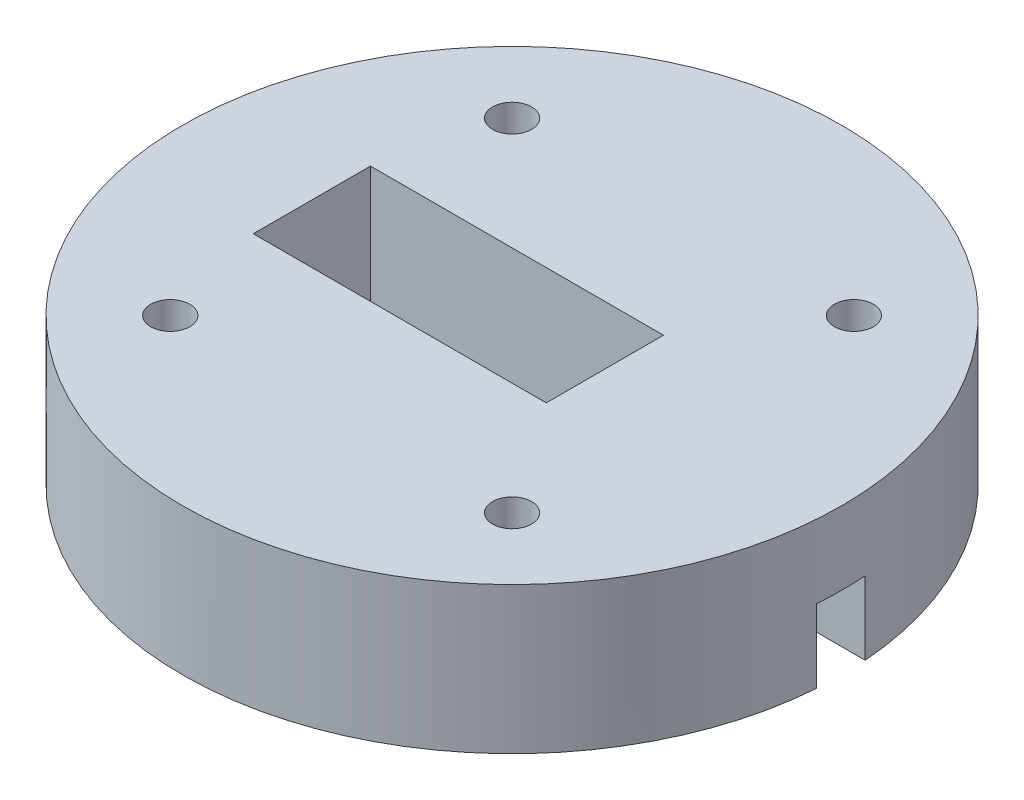
ISO-10303-21;
HEADER;
FILE_DESCRIPTION(('STEP AP214'),'2;1');
FILE_NAME('part.step','',(''),(''),'','','');
FILE_SCHEMA(('AUTOMOTIVE_DESIGN { 1 0 10303 214 1 1 1 1 }'));
ENDSEC;
DATA;
#1=APPLICATION_CONTEXT('core data for automotive mechanical design processes');
#2=APPLICATION_PROTOCOL_DEFINITION('international standard','automotive_design',2000,#1);
#3=PRODUCT_CONTEXT('',#1,'mechanical');
#4=PRODUCT('Part','Part','',(#3));
#5=PRODUCT_RELATED_PRODUCT_CATEGORY('part','',(#4));
#6=PRODUCT_DEFINITION_FORMATION('','',#4);
#7=PRODUCT_DEFINITION_CONTEXT('part definition',#1,'design');
#8=PRODUCT_DEFINITION('design','',#6,#7);
#9=PRODUCT_DEFINITION_SHAPE('','',#8);
#10=(LENGTH_UNIT() NAMED_UNIT(*) SI_UNIT(.MILLI.,.METRE.));
#11=(NAMED_UNIT(*) PLANE_ANGLE_UNIT() SI_UNIT($,.RADIAN.));
#12=(NAMED_UNIT(*) SI_UNIT($,.STERADIAN.) SOLID_ANGLE_UNIT());
#13=UNCERTAINTY_MEASURE_WITH_UNIT(LENGTH_MEASURE(1.E-05),#10,'distance_accuracy_value','');
#14=(GEOMETRIC_REPRESENTATION_CONTEXT(3) GLOBAL_UNCERTAINTY_ASSIGNED_CONTEXT((#13)) GLOBAL_UNIT_ASSIGNED_CONTEXT((#10,
#11,#12)) REPRESENTATION_CONTEXT('',''));
#15=CARTESIAN_POINT('',(0.,0.,0.));
#16=DIRECTION('',(0.,0.,1.));
#17=DIRECTION('',(1.,0.,0.));
#18=AXIS2_PLACEMENT_3D('',#15,#16,#17);
#19=CARTESIAN_POINT('',(0.,30.,0.));
#20=DIRECTION('',(0.,-1.,0.));
#21=DIRECTION('',(0.,0.,-1.));
#22=AXIS2_PLACEMENT_3D('',#19,#20,#21);
#23=CYLINDRICAL_SURFACE('',#22,67.5);
#24=CARTESIAN_POINT('',(0.,30.,0.));
#25=DIRECTION('',(0.,1.,0.));
#26=DIRECTION('',(0.,0.,1.));
#27=AXIS2_PLACEMENT_3D('',#24,#25,#26);
#28=CIRCLE('',#27,67.5);
#29=CARTESIAN_POINT('',(0.,30.,67.5));
#30=VERTEX_POINT('',#29);
#31=EDGE_CURVE('E117',#30,#30,#28,.T.);
#32=ORIENTED_EDGE('',*,*,#31,.F.);
#33=EDGE_LOOP('',(#32));
#34=FACE_BOUND('',#33,.T.);
#35=DIRECTION('',(0.,-1.,0.));
#36=VECTOR('',#35,1.);
#37=CARTESIAN_POINT('',(67.3145600891813,30.,-5.));
#38=LINE('',#37,#36);
#39=CARTESIAN_POINT('',(67.3145600891813,0.,-5.));
#40=VERTEX_POINT('',#39);
#41=CARTESIAN_POINT('',(67.3145600891813,15.,-5.));
#42=VERTEX_POINT('',#41);
#43=EDGE_CURVE('E100',#40,#42,#38,.F.);
#44=ORIENTED_EDGE('',*,*,#43,.F.);
#45=CARTESIAN_POINT('',(0.,0.,0.));
#46=DIRECTION('',(0.,1.,0.));
#47=DIRECTION('',(0.,0.,1.));
#48=AXIS2_PLACEMENT_3D('',#45,#46,#47);
#49=CIRCLE('',#48,67.5);
#50=CARTESIAN_POINT('',(67.3145600891813,0.,5.));
#51=VERTEX_POINT('',#50);
#52=EDGE_CURVE('E112',#40,#51,#49,.T.);
#53=ORIENTED_EDGE('',*,*,#52,.T.);
#54=DIRECTION('',(0.,-1.,0.));
#55=VECTOR('',#54,1.);
#56=CARTESIAN_POINT('',(67.3145600891813,30.,5.));
#57=LINE('',#56,#55);
#58=CARTESIAN_POINT('',(67.3145600891813,15.,5.));
#59=VERTEX_POINT('',#58);
#60=EDGE_CURVE('E134',#59,#51,#57,.T.);
#61=ORIENTED_EDGE('',*,*,#60,.F.);
#62=CARTESIAN_POINT('',(0.,15.,0.));
#63=DIRECTION('',(0.,-1.,0.));
#64=DIRECTION('',(0.,0.,-1.));
#65=AXIS2_PLACEMENT_3D('',#62,#63,#64);
#66=CIRCLE('',#65,67.5);
#67=EDGE_CURVE('E113',#42,#59,#66,.T.);
#68=ORIENTED_EDGE('',*,*,#67,.F.);
#69=EDGE_LOOP('',(#44,#53,#61,#68));
#70=FACE_BOUND('',#69,.T.);
#71=ADVANCED_FACE('F33',(#34,#70),#23,.T.);
#72=CARTESIAN_POINT('',(0.,0.,0.));
#73=DIRECTION('',(0.,1.,0.));
#74=DIRECTION('',(0.,0.,1.));
#75=AXIS2_PLACEMENT_3D('',#72,#73,#74);
#76=PLANE('',#75);
#77=CARTESIAN_POINT('',(-35.0017856687342,0.,-35.0017856687321));
#78=DIRECTION('',(0.,1.,0.));
#79=DIRECTION('',(0.,0.,1.));
#80=AXIS2_PLACEMENT_3D('',#77,#78,#79);
#81=CIRCLE('',#80,4.00000000000209);
#82=CARTESIAN_POINT('',(-35.0017856687342,0.,-31.00178566873));
#83=VERTEX_POINT('',#82);
#84=EDGE_CURVE('E194',#83,#83,#81,.T.);
#85=ORIENTED_EDGE('',*,*,#84,.T.);
#86=EDGE_LOOP('',(#85));
#87=FACE_BOUND('',#86,.T.);
#88=CARTESIAN_POINT('',(-35.0017856687321,0.,35.0017856687361));
#89=DIRECTION('',(0.,1.,0.));
#90=DIRECTION('',(0.,0.,1.));
#91=AXIS2_PLACEMENT_3D('',#88,#89,#90);
#92=CIRCLE('',#91,4.00000000000143);
#93=CARTESIAN_POINT('',(-35.0017856687321,0.,39.0017856687375));
#94=VERTEX_POINT('',#93);
#95=EDGE_CURVE('E200',#94,#94,#92,.T.);
#96=ORIENTED_EDGE('',*,*,#95,.T.);
#97=EDGE_LOOP('',(#96));
#98=FACE_BOUND('',#97,.T.);
#99=CARTESIAN_POINT('',(35.0017856687361,0.,35.0017856687341));
#100=DIRECTION('',(0.,1.,0.));
#101=DIRECTION('',(0.,0.,1.));
#102=AXIS2_PLACEMENT_3D('',#99,#100,#101);
#103=CIRCLE('',#102,3.99999999999952);
#104=CARTESIAN_POINT('',(35.0017856687361,0.,39.0017856687336));
#105=VERTEX_POINT('',#104);
#106=EDGE_CURVE('E188',#105,#105,#103,.T.);
#107=ORIENTED_EDGE('',*,*,#106,.T.);
#108=EDGE_LOOP('',(#107));
#109=FACE_BOUND('',#108,.T.);
#110=CARTESIAN_POINT('',(35.0017856687341,0.,-35.0017856687342));
#111=DIRECTION('',(0.,1.,0.));
#112=DIRECTION('',(0.,0.,1.));
#113=AXIS2_PLACEMENT_3D('',#110,#111,#112);
#114=CIRCLE('',#113,4.);
#115=CARTESIAN_POINT('',(35.0017856687341,0.,-31.0017856687342));
#116=VERTEX_POINT('',#115);
#117=EDGE_CURVE('E106',#116,#116,#114,.T.);
#118=ORIENTED_EDGE('',*,*,#117,.T.);
#119=EDGE_LOOP('',(#118));
#120=FACE_BOUND('',#119,.T.);
#121=DIRECTION('',(-1.,0.,0.));
#122=VECTOR('',#121,1.);
#123=CARTESIAN_POINT('',(97.,0.,-5.));
#124=LINE('',#123,#122);
#125=CARTESIAN_POINT('',(19.,0.,-5.));
#126=VERTEX_POINT('',#125);
#127=EDGE_CURVE('E96',#40,#126,#124,.T.);
#128=ORIENTED_EDGE('',*,*,#127,.T.);
#129=DIRECTION('',(0.,0.,-1.));
#130=VECTOR('',#129,1.);
#131=CARTESIAN_POINT('',(19.,0.,12.));
#132=LINE('',#131,#130);
#133=CARTESIAN_POINT('',(19.,0.,-12.));
#134=VERTEX_POINT('',#133);
#135=EDGE_CURVE('E137',#126,#134,#132,.T.);
#136=ORIENTED_EDGE('',*,*,#135,.T.);
#137=DIRECTION('',(-1.,0.,0.));
#138=VECTOR('',#137,1.);
#139=CARTESIAN_POINT('',(-41.,0.,-12.));
#140=LINE('',#139,#138);
#141=CARTESIAN_POINT('',(-41.,0.,-12.));
#142=VERTEX_POINT('',#141);
#143=EDGE_CURVE('E144',#134,#142,#140,.T.);
#144=ORIENTED_EDGE('',*,*,#143,.T.);
#145=DIRECTION('',(0.,0.,1.));
#146=VECTOR('',#145,1.);
#147=CARTESIAN_POINT('',(-41.,0.,12.));
#148=LINE('',#147,#146);
#149=CARTESIAN_POINT('',(-41.,0.,12.));
#150=VERTEX_POINT('',#149);
#151=EDGE_CURVE('E151',#142,#150,#148,.T.);
#152=ORIENTED_EDGE('',*,*,#151,.T.);
#153=DIRECTION('',(1.,0.,0.));
#154=VECTOR('',#153,1.);
#155=CARTESIAN_POINT('',(-41.,0.,12.));
#156=LINE('',#155,#154);
#157=CARTESIAN_POINT('',(19.,0.,12.));
#158=VERTEX_POINT('',#157);
#159=EDGE_CURVE('E154',#150,#158,#156,.T.);
#160=ORIENTED_EDGE('',*,*,#159,.T.);
#161=CARTESIAN_POINT('',(19.,0.,5.));
#162=VERTEX_POINT('',#161);
#163=EDGE_CURVE('E141',#158,#162,#132,.T.);
#164=ORIENTED_EDGE('',*,*,#163,.T.);
#165=DIRECTION('',(-1.,0.,0.));
#166=VECTOR('',#165,1.);
#167=CARTESIAN_POINT('',(97.,0.,5.));
#168=LINE('',#167,#166);
#169=EDGE_CURVE('E47',#51,#162,#168,.T.);
#170=ORIENTED_EDGE('',*,*,#169,.F.);
#171=ORIENTED_EDGE('',*,*,#52,.F.);
#172=EDGE_LOOP('',(#128,#136,#144,#152,#160,#164,#170,#171));
#173=FACE_BOUND('',#172,.T.);
#174=ADVANCED_FACE('F115',(#87,#98,#109,#120,#173),#76,.F.);
#175=CARTESIAN_POINT('',(19.,0.,12.));
#176=DIRECTION('',(1.,0.,0.));
#177=DIRECTION('',(0.,0.,-1.));
#178=AXIS2_PLACEMENT_3D('',#175,#176,#177);
#179=PLANE('',#178);
#180=DIRECTION('',(0.,-1.,0.));
#181=VECTOR('',#180,1.);
#182=CARTESIAN_POINT('',(19.,0.,-5.));
#183=LINE('',#182,#181);
#184=CARTESIAN_POINT('',(19.,15.,-5.));
#185=VERTEX_POINT('',#184);
#186=EDGE_CURVE('E11',#185,#126,#183,.T.);
#187=ORIENTED_EDGE('',*,*,#186,.F.);
#188=DIRECTION('',(0.,0.,-1.));
#189=VECTOR('',#188,1.);
#190=CARTESIAN_POINT('',(19.,15.,12.));
#191=LINE('',#190,#189);
#192=CARTESIAN_POINT('',(19.,15.,5.));
#193=VERTEX_POINT('',#192);
#194=EDGE_CURVE('E40',#193,#185,#191,.T.);
#195=ORIENTED_EDGE('',*,*,#194,.F.);
#196=DIRECTION('',(0.,1.,0.));
#197=VECTOR('',#196,1.);
#198=CARTESIAN_POINT('',(19.,0.,5.));
#199=LINE('',#198,#197);
#200=EDGE_CURVE('E121',#162,#193,#199,.T.);
#201=ORIENTED_EDGE('',*,*,#200,.F.);
#202=ORIENTED_EDGE('',*,*,#163,.F.);
#203=DIRECTION('',(0.,1.,0.));
#204=VECTOR('',#203,1.);
#205=CARTESIAN_POINT('',(19.,0.,12.));
#206=LINE('',#205,#204);
#207=CARTESIAN_POINT('',(19.,30.,12.));
#208=VERTEX_POINT('',#207);
#209=EDGE_CURVE('E118',#158,#208,#206,.T.);
#210=ORIENTED_EDGE('',*,*,#209,.T.);
#211=DIRECTION('',(0.,0.,-1.));
#212=VECTOR('',#211,1.);
#213=CARTESIAN_POINT('',(19.,30.,12.));
#214=LINE('',#213,#212);
#215=CARTESIAN_POINT('',(19.,30.,-12.));
#216=VERTEX_POINT('',#215);
#217=EDGE_CURVE('E55',#208,#216,#214,.T.);
#218=ORIENTED_EDGE('',*,*,#217,.T.);
#219=DIRECTION('',(0.,1.,0.));
#220=VECTOR('',#219,1.);
#221=CARTESIAN_POINT('',(19.,0.,-12.));
#222=LINE('',#221,#220);
#223=EDGE_CURVE('E138',#134,#216,#222,.T.);
#224=ORIENTED_EDGE('',*,*,#223,.F.);
#225=ORIENTED_EDGE('',*,*,#135,.F.);
#226=EDGE_LOOP('',(#187,#195,#201,#202,#210,#218,#224,#225));
#227=FACE_BOUND('',#226,.T.);
#228=ADVANCED_FACE('F136',(#227),#179,.F.);
#229=CARTESIAN_POINT('',(0.,30.,0.));
#230=DIRECTION('',(0.,1.,0.));
#231=DIRECTION('',(0.,0.,1.));
#232=AXIS2_PLACEMENT_3D('',#229,#230,#231);
#233=PLANE('',#232);
#234=CARTESIAN_POINT('',(-35.0017856687342,30.,-35.0017856687321));
#235=DIRECTION('',(0.,1.,0.));
#236=DIRECTION('',(0.,0.,1.));
#237=AXIS2_PLACEMENT_3D('',#234,#235,#236);
#238=CIRCLE('',#237,4.00000000000209);
#239=CARTESIAN_POINT('',(-35.0017856687342,30.,-31.00178566873));
#240=VERTEX_POINT('',#239);
#241=EDGE_CURVE('E191',#240,#240,#238,.T.);
#242=ORIENTED_EDGE('',*,*,#241,.F.);
#243=EDGE_LOOP('',(#242));
#244=FACE_BOUND('',#243,.T.);
#245=CARTESIAN_POINT('',(-35.0017856687321,30.,35.0017856687361));
#246=DIRECTION('',(0.,1.,0.));
#247=DIRECTION('',(0.,0.,1.));
#248=AXIS2_PLACEMENT_3D('',#245,#246,#247);
#249=CIRCLE('',#248,4.00000000000143);
#250=CARTESIAN_POINT('',(-35.0017856687321,30.,39.0017856687375));
#251=VERTEX_POINT('',#250);
#252=EDGE_CURVE('E197',#251,#251,#249,.T.);
#253=ORIENTED_EDGE('',*,*,#252,.F.);
#254=EDGE_LOOP('',(#253));
#255=FACE_BOUND('',#254,.T.);
#256=CARTESIAN_POINT('',(35.0017856687361,30.,35.0017856687341));
#257=DIRECTION('',(0.,1.,0.));
#258=DIRECTION('',(0.,0.,1.));
#259=AXIS2_PLACEMENT_3D('',#256,#257,#258);
#260=CIRCLE('',#259,3.99999999999952);
#261=CARTESIAN_POINT('',(35.0017856687361,30.,39.0017856687336));
#262=VERTEX_POINT('',#261);
#263=EDGE_CURVE('E203',#262,#262,#260,.T.);
#264=ORIENTED_EDGE('',*,*,#263,.F.);
#265=EDGE_LOOP('',(#264));
#266=FACE_BOUND('',#265,.T.);
#267=CARTESIAN_POINT('',(35.0017856687341,30.,-35.0017856687342));
#268=DIRECTION('',(0.,1.,0.));
#269=DIRECTION('',(0.,0.,1.));
#270=AXIS2_PLACEMENT_3D('',#267,#268,#269);
#271=CIRCLE('',#270,4.);
#272=CARTESIAN_POINT('',(35.0017856687341,30.,-31.0017856687342));
#273=VERTEX_POINT('',#272);
#274=EDGE_CURVE('E185',#273,#273,#271,.T.);
#275=ORIENTED_EDGE('',*,*,#274,.F.);
#276=EDGE_LOOP('',(#275));
#277=FACE_BOUND('',#276,.T.);
#278=ORIENTED_EDGE('',*,*,#217,.F.);
#279=DIRECTION('',(1.,0.,0.));
#280=VECTOR('',#279,1.);
#281=CARTESIAN_POINT('',(-41.,30.,12.));
#282=LINE('',#281,#280);
#283=CARTESIAN_POINT('',(-41.,30.,12.));
#284=VERTEX_POINT('',#283);
#285=EDGE_CURVE('E142',#284,#208,#282,.T.);
#286=ORIENTED_EDGE('',*,*,#285,.F.);
#287=DIRECTION('',(0.,0.,1.));
#288=VECTOR('',#287,1.);
#289=CARTESIAN_POINT('',(-41.,30.,12.));
#290=LINE('',#289,#288);
#291=CARTESIAN_POINT('',(-41.,30.,-12.));
#292=VERTEX_POINT('',#291);
#293=EDGE_CURVE('E146',#292,#284,#290,.T.);
#294=ORIENTED_EDGE('',*,*,#293,.F.);
#295=DIRECTION('',(-1.,0.,0.));
#296=VECTOR('',#295,1.);
#297=CARTESIAN_POINT('',(-41.,30.,-12.));
#298=LINE('',#297,#296);
#299=EDGE_CURVE('E158',#216,#292,#298,.T.);
#300=ORIENTED_EDGE('',*,*,#299,.F.);
#301=EDGE_LOOP('',(#278,#286,#294,#300));
#302=FACE_BOUND('',#301,.T.);
#303=ORIENTED_EDGE('',*,*,#31,.T.);
#304=EDGE_LOOP('',(#303));
#305=FACE_BOUND('',#304,.T.);
#306=ADVANCED_FACE('F171',(#244,#255,#266,#277,#302,#305),#233,.T.);
#307=CARTESIAN_POINT('',(-41.,0.,12.));
#308=DIRECTION('',(0.,0.,1.));
#309=DIRECTION('',(1.,0.,0.));
#310=AXIS2_PLACEMENT_3D('',#307,#308,#309);
#311=PLANE('',#310);
#312=ORIENTED_EDGE('',*,*,#285,.T.);
#313=ORIENTED_EDGE('',*,*,#209,.F.);
#314=ORIENTED_EDGE('',*,*,#159,.F.);
#315=DIRECTION('',(0.,1.,0.));
#316=VECTOR('',#315,1.);
#317=CARTESIAN_POINT('',(-41.,0.,12.));
#318=LINE('',#317,#316);
#319=EDGE_CURVE('E123',#150,#284,#318,.T.);
#320=ORIENTED_EDGE('',*,*,#319,.T.);
#321=EDGE_LOOP('',(#312,#313,#314,#320));
#322=FACE_BOUND('',#321,.T.);
#323=ADVANCED_FACE('F179',(#322),#311,.F.);
#324=CARTESIAN_POINT('',(-41.,0.,12.));
#325=DIRECTION('',(-1.,0.,0.));
#326=DIRECTION('',(0.,0.,1.));
#327=AXIS2_PLACEMENT_3D('',#324,#325,#326);
#328=PLANE('',#327);
#329=ORIENTED_EDGE('',*,*,#293,.T.);
#330=ORIENTED_EDGE('',*,*,#319,.F.);
#331=ORIENTED_EDGE('',*,*,#151,.F.);
#332=DIRECTION('',(0.,1.,0.));
#333=VECTOR('',#332,1.);
#334=CARTESIAN_POINT('',(-41.,0.,-12.));
#335=LINE('',#334,#333);
#336=EDGE_CURVE('E164',#142,#292,#335,.T.);
#337=ORIENTED_EDGE('',*,*,#336,.T.);
#338=EDGE_LOOP('',(#329,#330,#331,#337));
#339=FACE_BOUND('',#338,.T.);
#340=ADVANCED_FACE('F175',(#339),#328,.F.);
#341=CARTESIAN_POINT('',(-41.,0.,-12.));
#342=DIRECTION('',(0.,0.,-1.));
#343=DIRECTION('',(-1.,0.,0.));
#344=AXIS2_PLACEMENT_3D('',#341,#342,#343);
#345=PLANE('',#344);
#346=ORIENTED_EDGE('',*,*,#299,.T.);
#347=ORIENTED_EDGE('',*,*,#336,.F.);
#348=ORIENTED_EDGE('',*,*,#143,.F.);
#349=ORIENTED_EDGE('',*,*,#223,.T.);
#350=EDGE_LOOP('',(#346,#347,#348,#349));
#351=FACE_BOUND('',#350,.T.);
#352=ADVANCED_FACE('F167',(#351),#345,.F.);
#353=CARTESIAN_POINT('',(97.,0.,-5.));
#354=DIRECTION('',(0.,0.,1.));
#355=DIRECTION('',(0.,-1.,0.));
#356=AXIS2_PLACEMENT_3D('',#353,#354,#355);
#357=PLANE('',#356);
#358=ORIENTED_EDGE('',*,*,#43,.T.);
#359=DIRECTION('',(-1.,0.,0.));
#360=VECTOR('',#359,1.);
#361=CARTESIAN_POINT('',(97.,15.,-5.));
#362=LINE('',#361,#360);
#363=EDGE_CURVE('E131',#42,#185,#362,.T.);
#364=ORIENTED_EDGE('',*,*,#363,.T.);
#365=ORIENTED_EDGE('',*,*,#186,.T.);
#366=ORIENTED_EDGE('',*,*,#127,.F.);
#367=EDGE_LOOP('',(#358,#364,#365,#366));
#368=FACE_BOUND('',#367,.T.);
#369=ADVANCED_FACE('F98',(#368),#357,.T.);
#370=CARTESIAN_POINT('',(97.,15.,5.));
#371=DIRECTION('',(0.,-1.,0.));
#372=DIRECTION('',(0.,0.,-1.));
#373=AXIS2_PLACEMENT_3D('',#370,#371,#372);
#374=PLANE('',#373);
#375=ORIENTED_EDGE('',*,*,#67,.T.);
#376=DIRECTION('',(-1.,0.,0.));
#377=VECTOR('',#376,1.);
#378=CARTESIAN_POINT('',(97.,15.,5.));
#379=LINE('',#378,#377);
#380=EDGE_CURVE('E133',#59,#193,#379,.T.);
#381=ORIENTED_EDGE('',*,*,#380,.T.);
#382=ORIENTED_EDGE('',*,*,#194,.T.);
#383=ORIENTED_EDGE('',*,*,#363,.F.);
#384=EDGE_LOOP('',(#375,#381,#382,#383));
#385=FACE_BOUND('',#384,.T.);
#386=ADVANCED_FACE('F130',(#385),#374,.T.);
#387=CARTESIAN_POINT('',(97.,0.,5.));
#388=DIRECTION('',(0.,0.,-1.));
#389=DIRECTION('',(0.,1.,0.));
#390=AXIS2_PLACEMENT_3D('',#387,#388,#389);
#391=PLANE('',#390);
#392=ORIENTED_EDGE('',*,*,#60,.T.);
#393=ORIENTED_EDGE('',*,*,#169,.T.);
#394=ORIENTED_EDGE('',*,*,#200,.T.);
#395=ORIENTED_EDGE('',*,*,#380,.F.);
#396=EDGE_LOOP('',(#392,#393,#394,#395));
#397=FACE_BOUND('',#396,.T.);
#398=ADVANCED_FACE('F180',(#397),#391,.T.);
#399=CARTESIAN_POINT('',(35.0017856687341,0.,-35.0017856687342));
#400=DIRECTION('',(0.,1.,0.));
#401=DIRECTION('',(0.,0.,1.));
#402=AXIS2_PLACEMENT_3D('',#399,#400,#401);
#403=CYLINDRICAL_SURFACE('',#402,4.);
#404=ORIENTED_EDGE('',*,*,#117,.F.);
#405=EDGE_LOOP('',(#404));
#406=FACE_BOUND('',#405,.T.);
#407=ORIENTED_EDGE('',*,*,#274,.T.);
#408=EDGE_LOOP('',(#407));
#409=FACE_BOUND('',#408,.T.);
#410=ADVANCED_FACE('F215',(#406,#409),#403,.F.);
#411=CARTESIAN_POINT('',(35.0017856687361,0.,35.0017856687341));
#412=DIRECTION('',(0.,1.,0.));
#413=DIRECTION('',(0.,0.,1.));
#414=AXIS2_PLACEMENT_3D('',#411,#412,#413);
#415=CYLINDRICAL_SURFACE('',#414,3.99999999999952);
#416=ORIENTED_EDGE('',*,*,#106,.F.);
#417=EDGE_LOOP('',(#416));
#418=FACE_BOUND('',#417,.T.);
#419=ORIENTED_EDGE('',*,*,#263,.T.);
#420=EDGE_LOOP('',(#419));
#421=FACE_BOUND('',#420,.T.);
#422=ADVANCED_FACE('F211',(#418,#421),#415,.F.);
#423=CARTESIAN_POINT('',(-35.0017856687321,0.,35.0017856687361));
#424=DIRECTION('',(0.,1.,0.));
#425=DIRECTION('',(0.,0.,1.));
#426=AXIS2_PLACEMENT_3D('',#423,#424,#425);
#427=CYLINDRICAL_SURFACE('',#426,4.00000000000143);
#428=ORIENTED_EDGE('',*,*,#95,.F.);
#429=EDGE_LOOP('',(#428));
#430=FACE_BOUND('',#429,.T.);
#431=ORIENTED_EDGE('',*,*,#252,.T.);
#432=EDGE_LOOP('',(#431));
#433=FACE_BOUND('',#432,.T.);
#434=ADVANCED_FACE('F214',(#430,#433),#427,.F.);
#435=CARTESIAN_POINT('',(-35.0017856687342,0.,-35.0017856687321));
#436=DIRECTION('',(0.,1.,0.));
#437=DIRECTION('',(0.,0.,1.));
#438=AXIS2_PLACEMENT_3D('',#435,#436,#437);
#439=CYLINDRICAL_SURFACE('',#438,4.00000000000209);
#440=ORIENTED_EDGE('',*,*,#84,.F.);
#441=EDGE_LOOP('',(#440));
#442=FACE_BOUND('',#441,.T.);
#443=ORIENTED_EDGE('',*,*,#241,.T.);
#444=EDGE_LOOP('',(#443));
#445=FACE_BOUND('',#444,.T.);
#446=ADVANCED_FACE('F296',(#442,#445),#439,.F.);
#447=CLOSED_SHELL('',(#71,#174,#228,#306,#323,#340,#352,#369,#386,#398,#410,#422,#434,#446));
#448=MANIFOLD_SOLID_BREP('B2',#447);
#449=ADVANCED_BREP_SHAPE_REPRESENTATION('',(#18,#448),#14);
#450=SHAPE_DEFINITION_REPRESENTATION(#9,#449);
ENDSEC;
END-ISO-10303-21;
